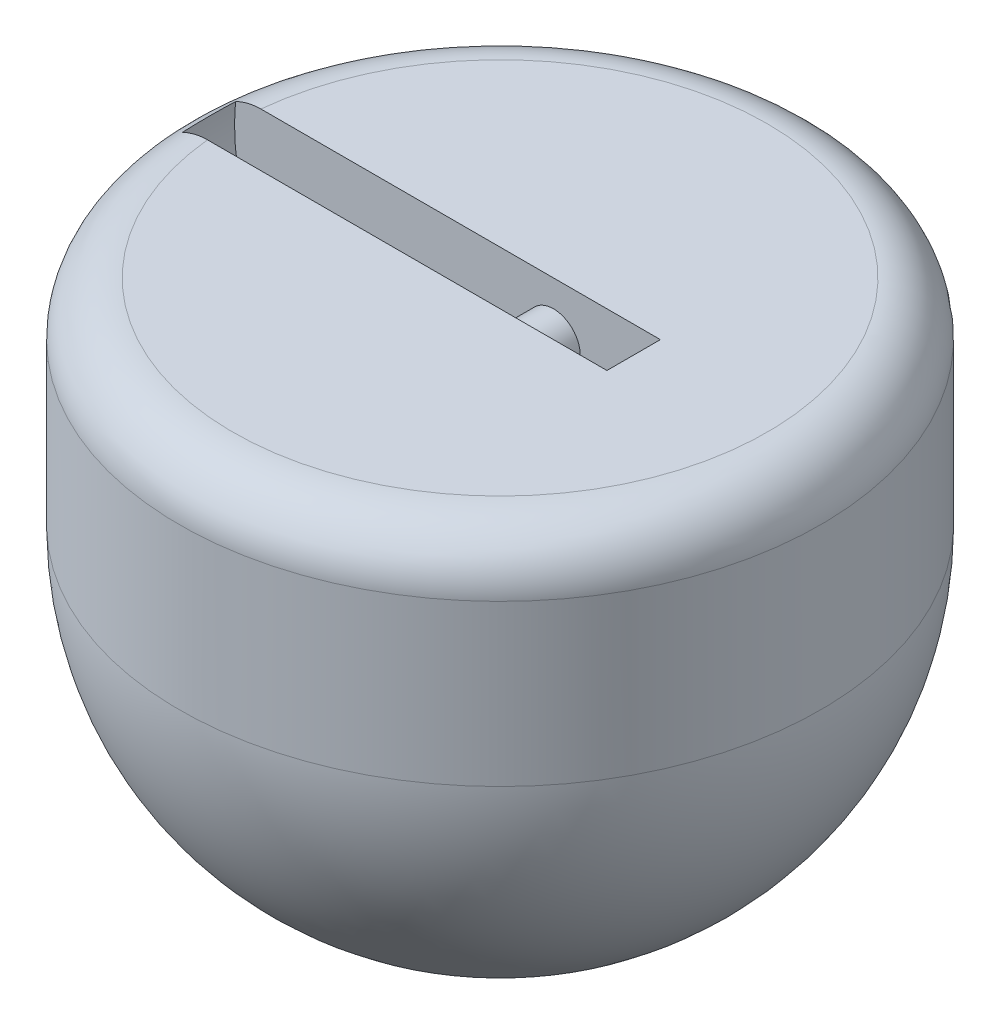
ISO-10303-21;
HEADER;
FILE_DESCRIPTION(('STEP AP214'),'2;1');
FILE_NAME('part.step','',(''),(''),'','','');
FILE_SCHEMA(('AUTOMOTIVE_DESIGN { 1 0 10303 214 1 1 1 1 }'));
ENDSEC;
DATA;
#1=APPLICATION_CONTEXT('core data for automotive mechanical design processes');
#2=APPLICATION_PROTOCOL_DEFINITION('international standard','automotive_design',2000,#1);
#3=PRODUCT_CONTEXT('',#1,'mechanical');
#4=PRODUCT('Part','Part','',(#3));
#5=PRODUCT_RELATED_PRODUCT_CATEGORY('part','',(#4));
#6=PRODUCT_DEFINITION_FORMATION('','',#4);
#7=PRODUCT_DEFINITION_CONTEXT('part definition',#1,'design');
#8=PRODUCT_DEFINITION('design','',#6,#7);
#9=PRODUCT_DEFINITION_SHAPE('','',#8);
#10=(LENGTH_UNIT() NAMED_UNIT(*) SI_UNIT(.MILLI.,.METRE.));
#11=(NAMED_UNIT(*) PLANE_ANGLE_UNIT() SI_UNIT($,.RADIAN.));
#12=(NAMED_UNIT(*) SI_UNIT($,.STERADIAN.) SOLID_ANGLE_UNIT());
#13=UNCERTAINTY_MEASURE_WITH_UNIT(LENGTH_MEASURE(1.E-05),#10,'distance_accuracy_value','');
#14=(GEOMETRIC_REPRESENTATION_CONTEXT(3) GLOBAL_UNCERTAINTY_ASSIGNED_CONTEXT((#13)) GLOBAL_UNIT_ASSIGNED_CONTEXT((#10,
#11,#12)) REPRESENTATION_CONTEXT('',''));
#15=CARTESIAN_POINT('',(0.,0.,0.));
#16=DIRECTION('',(0.,0.,1.));
#17=DIRECTION('',(1.,0.,0.));
#18=AXIS2_PLACEMENT_3D('',#15,#16,#17);
#19=CARTESIAN_POINT('',(0.,6.04095563139931,0.));
#20=DIRECTION('',(0.,1.,0.));
#21=DIRECTION('',(0.,0.,1.));
#22=AXIS2_PLACEMENT_3D('',#19,#20,#21);
#23=PLANE('',#22);
#24=DIRECTION('',(0.,0.,1.));
#25=VECTOR('',#24,1.);
#26=CARTESIAN_POINT('',(5.,6.04095563139931,-1.));
#27=LINE('',#26,#25);
#28=CARTESIAN_POINT('',(5.,6.04095563139931,-1.));
#29=VERTEX_POINT('',#28);
#30=CARTESIAN_POINT('',(5.,6.04095563139931,1.));
#31=VERTEX_POINT('',#30);
#32=EDGE_CURVE('E90',#29,#31,#27,.T.);
#33=ORIENTED_EDGE('',*,*,#32,.T.);
#34=DIRECTION('',(-1.,0.,0.));
#35=VECTOR('',#34,1.);
#36=CARTESIAN_POINT('',(5.,6.04095563139931,1.));
#37=LINE('',#36,#35);
#38=CARTESIAN_POINT('',(-9.94987437106621,6.04095563139931,1.));
#39=VERTEX_POINT('',#38);
#40=EDGE_CURVE('E88',#31,#39,#37,.T.);
#41=ORIENTED_EDGE('',*,*,#40,.T.);
#42=CARTESIAN_POINT('',(0.,6.04095563139931,0.));
#43=DIRECTION('',(0.,-1.,0.));
#44=DIRECTION('',(0.,0.,-1.));
#45=AXIS2_PLACEMENT_3D('',#42,#43,#44);
#46=CIRCLE('',#45,9.99999999999999);
#47=CARTESIAN_POINT('',(-9.94987437106621,6.04095563139931,-1.));
#48=VERTEX_POINT('',#47);
#49=EDGE_CURVE('E98',#48,#39,#46,.T.);
#50=ORIENTED_EDGE('',*,*,#49,.F.);
#51=DIRECTION('',(-1.,0.,0.));
#52=VECTOR('',#51,1.);
#53=CARTESIAN_POINT('',(5.,6.04095563139931,-1.));
#54=LINE('',#53,#52);
#55=EDGE_CURVE('E68',#29,#48,#54,.T.);
#56=ORIENTED_EDGE('',*,*,#55,.F.);
#57=EDGE_LOOP('',(#33,#41,#50,#56));
#58=FACE_BOUND('',#57,.T.);
#59=ADVANCED_FACE('F44',(#58),#23,.T.);
#60=CARTESIAN_POINT('',(0.,-1.95904436860069,0.));
#61=DIRECTION('',(0.,-1.,0.));
#62=DIRECTION('',(-1.,0.,0.));
#63=AXIS2_PLACEMENT_3D('',#60,#61,#62);
#64=SPHERICAL_SURFACE('',#63,12.);
#65=CARTESIAN_POINT('',(0.,-1.95904436860069,0.));
#66=DIRECTION('',(0.,-1.,0.));
#67=DIRECTION('',(0.,0.,-1.));
#68=AXIS2_PLACEMENT_3D('',#65,#66,#67);
#69=CIRCLE('',#68,12.);
#70=CARTESIAN_POINT('',(0.,-1.95904436860069,-12.));
#71=VERTEX_POINT('',#70);
#72=EDGE_CURVE('E94',#71,#71,#69,.T.);
#73=ORIENTED_EDGE('',*,*,#72,.T.);
#74=EDGE_LOOP('',(#73));
#75=FACE_BOUND('',#74,.T.);
#76=ADVANCED_FACE('F50',(#75),#64,.T.);
#77=CARTESIAN_POINT('',(0.,4.04095563139931,0.));
#78=DIRECTION('',(0.,-1.,0.));
#79=DIRECTION('',(0.,0.,-1.));
#80=AXIS2_PLACEMENT_3D('',#77,#78,#79);
#81=TOROIDAL_SURFACE('',#80,10.,2.);
#82=CARTESIAN_POINT('',(-9.9330885538736,6.0408858948564,-1.));
#83=CARTESIAN_POINT('',(-10.0462989429806,6.04182164584969,-1.));
#84=CARTESIAN_POINT('',(-10.159669716052,6.03322061448164,-1.));
#85=CARTESIAN_POINT('',(-10.3834570987458,5.99711763464933,-1.));
#86=CARTESIAN_POINT('',(-10.4938700575215,5.96959335361088,-1.));
#87=CARTESIAN_POINT('',(-10.7084759471421,5.89638651120352,-1.));
#88=CARTESIAN_POINT('',(-10.8126708987826,5.85070988655241,-1.));
#89=CARTESIAN_POINT('',(-11.011854670136,5.74247516742079,-1.));
#90=CARTESIAN_POINT('',(-11.1068458286359,5.67992137698877,-1.));
#91=CARTESIAN_POINT('',(-11.284677023144,5.53987159282624,-1.));
#92=CARTESIAN_POINT('',(-11.3675488453222,5.46241596676805,-1.));
#93=CARTESIAN_POINT('',(-11.519050881552,5.2946381359982,-1.));
#94=CARTESIAN_POINT('',(-11.5876808297572,5.20431569116076,-1.));
#95=CARTESIAN_POINT('',(-11.7084575531279,5.01376343128643,-1.));
#96=CARTESIAN_POINT('',(-11.7606696798913,4.91357503592281,-1.));
#97=CARTESIAN_POINT('',(-11.8474736003975,4.70583582464108,-1.));
#98=CARTESIAN_POINT('',(-11.8820657549465,4.59828515953217,-1.));
#99=CARTESIAN_POINT('',(-11.9325484689947,4.37922522543764,-1.));
#100=CARTESIAN_POINT('',(-11.9484954230977,4.2677289499922,-1.));
#101=CARTESIAN_POINT('',(-11.961416114217,4.04364303505724,-1.));
#102=CARTESIAN_POINT('',(-11.9583900791792,3.93105340871973,-1.));
#103=CARTESIAN_POINT('',(-11.9334699458617,3.70813806293273,-1.));
#104=CARTESIAN_POINT('',(-11.911601507794,3.59780947343283,-1.));
#105=CARTESIAN_POINT('',(-11.8496623483004,3.38238663334615,-1.));
#106=CARTESIAN_POINT('',(-11.8095916201206,3.27729238470154,-1.));
#107=CARTESIAN_POINT('',(-11.7123736895719,3.07525143566259,-1.));
#108=CARTESIAN_POINT('',(-11.6552168259978,2.97830938469891,-1.));
#109=CARTESIAN_POINT('',(-11.5254756035598,2.79536773687267,-1.));
#110=CARTESIAN_POINT('',(-11.4528911079313,2.70936823702567,-1.));
#111=CARTESIAN_POINT('',(-11.2941775284812,2.55052604190073,-1.));
#112=CARTESIAN_POINT('',(-11.2080165615888,2.47771520667046,-1.));
#113=CARTESIAN_POINT('',(-11.0247319627463,2.3475291665414,-1.));
#114=CARTESIAN_POINT('',(-10.9276081345681,2.29015423799733,-1.));
#115=CARTESIAN_POINT('',(-10.724771934826,2.19223805611798,-1.));
#116=CARTESIAN_POINT('',(-10.6190290600092,2.15175999405685,-1.));
#117=CARTESIAN_POINT('',(-10.4022649018946,2.08905114982704,-1.));
#118=CARTESIAN_POINT('',(-10.2912434991517,2.06682078078406,-1.));
#119=CARTESIAN_POINT('',(-10.0665938503194,2.04114952582902,-1.));
#120=CARTESIAN_POINT('',(-9.95295687784447,2.03778498756196,-1.));
#121=CARTESIAN_POINT('',(-9.72672220332156,2.05012339444204,-1.));
#122=CARTESIAN_POINT('',(-9.61412452272578,2.06582673228963,-1.));
#123=CARTESIAN_POINT('',(-9.39282884322337,2.11592327800535,-1.));
#124=CARTESIAN_POINT('',(-9.28414282139825,2.15036941311284,-1.));
#125=CARTESIAN_POINT('',(-9.07409540600064,2.23702143124835,-1.));
#126=CARTESIAN_POINT('',(-8.97273406353201,2.28922743817142,-1.));
#127=CARTESIAN_POINT('',(-8.78025102795935,2.40993340284762,-1.));
#128=CARTESIAN_POINT('',(-8.68912746847332,2.47843038358194,-1.));
#129=CARTESIAN_POINT('',(-8.51973345676084,2.62981007301945,-1.));
#130=CARTESIAN_POINT('',(-8.44146277615733,2.71269252605979,-1.));
#131=CARTESIAN_POINT('',(-8.3003722116611,2.89012979326453,-1.));
#132=CARTESIAN_POINT('',(-8.23748816928118,2.98463358120499,-1.));
#133=CARTESIAN_POINT('',(-8.12860808904975,3.18291538107857,-1.));
#134=CARTESIAN_POINT('',(-8.082611336576,3.28669300033829,-1.));
#135=CARTESIAN_POINT('',(-8.0091485392196,3.49980476468546,-1.));
#136=CARTESIAN_POINT('',(-7.98155601137057,3.60909531193778,-1.));
#137=CARTESIAN_POINT('',(-7.94522532676466,3.83076571887735,-1.));
#138=CARTESIAN_POINT('',(-7.93648648899967,3.94314546683207,-1.));
#139=CARTESIAN_POINT('',(-7.93812277660038,4.16714180915342,-1.));
#140=CARTESIAN_POINT('',(-7.94839254482273,4.27875918899683,-1.));
#141=CARTESIAN_POINT('',(-7.98752966117842,4.49868271612908,-1.));
#142=CARTESIAN_POINT('',(-8.01639692930195,4.60698887766129,-1.));
#143=CARTESIAN_POINT('',(-8.09186421351167,4.81722282419308,-1.));
#144=CARTESIAN_POINT('',(-8.1384628182143,4.91915111610824,-1.));
#145=CARTESIAN_POINT('',(-8.24802088850465,5.11379191440821,-1.));
#146=CARTESIAN_POINT('',(-8.31098013233347,5.20650454568238,-1.));
#147=CARTESIAN_POINT('',(-8.4518121205303,5.38062054686787,-1.));
#148=CARTESIAN_POINT('',(-8.52976159812118,5.46196183894586,-1.));
#149=CARTESIAN_POINT('',(-8.69814886769036,5.61053567651073,-1.));
#150=CARTESIAN_POINT('',(-8.78859019896855,5.67776420979768,-1.));
#151=CARTESIAN_POINT('',(-8.98008909028235,5.79668921783555,-1.));
#152=CARTESIAN_POINT('',(-9.08122048325843,5.8482666722358,-1.));
#153=CARTESIAN_POINT('',(-9.290601567292,5.93373996865273,-1.));
#154=CARTESIAN_POINT('',(-9.39884284054881,5.96765631043258,-1.));
#155=CARTESIAN_POINT('',(-9.57864391786225,6.00784593631209,-1.));
#156=CARTESIAN_POINT('',(-9.649005359561,6.01970115820674,-1.));
#157=CARTESIAN_POINT('',(-9.79058618819193,6.03592655261466,-1.));
#158=CARTESIAN_POINT('',(-9.86180557814151,6.04029669879523,-1.));
#159=CARTESIAN_POINT('',(-9.9330885538736,6.0408858948564,-1.));
#160=B_SPLINE_CURVE_WITH_KNOTS('',3,(#82,#83,#84,#85,#86,#87,#88,#89,#90,#91,#92,#93,#94,#95,
#96,#97,#98,#99,#100,#101,#102,#103,#104,#105,#106,#107,#108,#109,#110,#111,#112,#113,#114,#115,
#116,#117,#118,#119,#120,#121,#122,#123,#124,#125,#126,#127,#128,#129,#130,#131,#132,#133,#134,
#135,#136,#137,#138,#139,#140,#141,#142,#143,#144,#145,#146,#147,#148,#149,#150,#151,#152,#153,
#154,#155,#156,#157,#158,#159),.UNSPECIFIED.,.T.,.F.,(4,2,2,2,2,2,2,2,2,2,2,2,2,2,2,2,2,2,2,2,2,
2,2,2,2,2,2,2,2,2,2,2,2,2,2,2,2,2,4),(0.,0.339383687932989,0.679168594017307,1.01884246489528,
1.35842979320999,1.69710984428131,2.03579621676533,2.37311685350225,2.71043058260826,
3.04672140549437,3.38300818811122,3.71883772671884,4.05466738993233,4.39068730542328,
4.72671019982566,5.06353430782301,5.40036444570529,5.73844322076486,6.07652964967855,
6.41598328979461,6.75544392103303,7.09586815810949,7.43629477007588,7.77665922008624,
8.11701762165818,8.45593165539756,8.79483134560237,9.13137726826673,9.46791103446008,
9.80258511084739,10.137257747416,10.4719037501953,10.8065452172802,11.1429476062551,
11.4794455039258,11.8184416636755,12.157043458739,12.3707358086463,12.5844289103273),.UNSPECIFIED.);
#161=CARTESIAN_POINT('',(-10.9009037574161,5.80271771838134,-1.));
#162=VERTEX_POINT('',#161);
#163=EDGE_CURVE('E84',#48,#162,#160,.T.);
#164=ORIENTED_EDGE('',*,*,#163,.F.);
#165=ORIENTED_EDGE('',*,*,#49,.T.);
#166=CARTESIAN_POINT('',(-9.9330885538736,6.0408858948564,1.));
#167=CARTESIAN_POINT('',(-10.0462989429806,6.04182164584969,1.));
#168=CARTESIAN_POINT('',(-10.159669716052,6.03322061448164,1.));
#169=CARTESIAN_POINT('',(-10.3834570987458,5.99711763464933,1.));
#170=CARTESIAN_POINT('',(-10.4938700575215,5.96959335361088,1.));
#171=CARTESIAN_POINT('',(-10.7084759471421,5.89638651120352,1.));
#172=CARTESIAN_POINT('',(-10.8126708987826,5.85070988655241,1.));
#173=CARTESIAN_POINT('',(-11.011854670136,5.74247516742079,1.));
#174=CARTESIAN_POINT('',(-11.1068458286359,5.67992137698877,1.));
#175=CARTESIAN_POINT('',(-11.284677023144,5.53987159282624,1.));
#176=CARTESIAN_POINT('',(-11.3675488453222,5.46241596676805,1.));
#177=CARTESIAN_POINT('',(-11.519050881552,5.2946381359982,1.));
#178=CARTESIAN_POINT('',(-11.5876808297572,5.20431569116076,1.));
#179=CARTESIAN_POINT('',(-11.7084575531279,5.01376343128643,1.));
#180=CARTESIAN_POINT('',(-11.7606696798913,4.91357503592281,1.));
#181=CARTESIAN_POINT('',(-11.8474736003975,4.70583582464108,1.));
#182=CARTESIAN_POINT('',(-11.8820657549465,4.59828515953217,1.));
#183=CARTESIAN_POINT('',(-11.9325484689947,4.37922522543764,1.));
#184=CARTESIAN_POINT('',(-11.9484954230977,4.2677289499922,1.));
#185=CARTESIAN_POINT('',(-11.961416114217,4.04364303505724,1.));
#186=CARTESIAN_POINT('',(-11.9583900791792,3.93105340871973,1.));
#187=CARTESIAN_POINT('',(-11.9334699458617,3.70813806293273,1.));
#188=CARTESIAN_POINT('',(-11.911601507794,3.59780947343283,1.));
#189=CARTESIAN_POINT('',(-11.8496623483004,3.38238663334615,1.));
#190=CARTESIAN_POINT('',(-11.8095916201206,3.27729238470154,1.));
#191=CARTESIAN_POINT('',(-11.7123736895719,3.07525143566259,1.));
#192=CARTESIAN_POINT('',(-11.6552168259978,2.97830938469891,1.));
#193=CARTESIAN_POINT('',(-11.5254756035598,2.79536773687267,1.));
#194=CARTESIAN_POINT('',(-11.4528911079313,2.70936823702567,1.));
#195=CARTESIAN_POINT('',(-11.2941775284812,2.55052604190073,1.));
#196=CARTESIAN_POINT('',(-11.2080165615888,2.47771520667046,1.));
#197=CARTESIAN_POINT('',(-11.0247319627463,2.3475291665414,1.));
#198=CARTESIAN_POINT('',(-10.9276081345681,2.29015423799733,1.));
#199=CARTESIAN_POINT('',(-10.724771934826,2.19223805611798,1.));
#200=CARTESIAN_POINT('',(-10.6190290600092,2.15175999405685,1.));
#201=CARTESIAN_POINT('',(-10.4022649018946,2.08905114982704,1.));
#202=CARTESIAN_POINT('',(-10.2912434991517,2.06682078078406,1.));
#203=CARTESIAN_POINT('',(-10.0665938503194,2.04114952582902,1.));
#204=CARTESIAN_POINT('',(-9.95295687784447,2.03778498756196,1.));
#205=CARTESIAN_POINT('',(-9.72672220332156,2.05012339444204,1.));
#206=CARTESIAN_POINT('',(-9.61412452272578,2.06582673228963,1.));
#207=CARTESIAN_POINT('',(-9.39282884322337,2.11592327800535,1.));
#208=CARTESIAN_POINT('',(-9.28414282139825,2.15036941311284,1.));
#209=CARTESIAN_POINT('',(-9.07409540600064,2.23702143124835,1.));
#210=CARTESIAN_POINT('',(-8.97273406353201,2.28922743817142,1.));
#211=CARTESIAN_POINT('',(-8.78025102795935,2.40993340284762,1.));
#212=CARTESIAN_POINT('',(-8.68912746847332,2.47843038358194,1.));
#213=CARTESIAN_POINT('',(-8.51973345676084,2.62981007301945,1.));
#214=CARTESIAN_POINT('',(-8.44146277615733,2.71269252605979,1.));
#215=CARTESIAN_POINT('',(-8.3003722116611,2.89012979326453,1.));
#216=CARTESIAN_POINT('',(-8.23748816928118,2.98463358120499,1.));
#217=CARTESIAN_POINT('',(-8.12860808904975,3.18291538107857,1.));
#218=CARTESIAN_POINT('',(-8.082611336576,3.28669300033829,1.));
#219=CARTESIAN_POINT('',(-8.0091485392196,3.49980476468546,1.));
#220=CARTESIAN_POINT('',(-7.98155601137057,3.60909531193778,1.));
#221=CARTESIAN_POINT('',(-7.94522532676466,3.83076571887735,1.));
#222=CARTESIAN_POINT('',(-7.93648648899967,3.94314546683207,1.));
#223=CARTESIAN_POINT('',(-7.93812277660038,4.16714180915342,1.));
#224=CARTESIAN_POINT('',(-7.94839254482273,4.27875918899683,1.));
#225=CARTESIAN_POINT('',(-7.98752966117842,4.49868271612908,1.));
#226=CARTESIAN_POINT('',(-8.01639692930195,4.60698887766129,1.));
#227=CARTESIAN_POINT('',(-8.09186421351167,4.81722282419308,1.));
#228=CARTESIAN_POINT('',(-8.1384628182143,4.91915111610824,1.));
#229=CARTESIAN_POINT('',(-8.24802088850465,5.11379191440821,1.));
#230=CARTESIAN_POINT('',(-8.31098013233347,5.20650454568238,1.));
#231=CARTESIAN_POINT('',(-8.4518121205303,5.38062054686787,1.));
#232=CARTESIAN_POINT('',(-8.52976159812118,5.46196183894586,1.));
#233=CARTESIAN_POINT('',(-8.69814886769036,5.61053567651073,1.));
#234=CARTESIAN_POINT('',(-8.78859019896855,5.67776420979768,1.));
#235=CARTESIAN_POINT('',(-8.98008909028235,5.79668921783555,1.));
#236=CARTESIAN_POINT('',(-9.08122048325843,5.8482666722358,1.));
#237=CARTESIAN_POINT('',(-9.290601567292,5.93373996865273,1.));
#238=CARTESIAN_POINT('',(-9.39884284054881,5.96765631043258,1.));
#239=CARTESIAN_POINT('',(-9.57864391786225,6.00784593631209,1.));
#240=CARTESIAN_POINT('',(-9.649005359561,6.01970115820674,1.));
#241=CARTESIAN_POINT('',(-9.79058618819193,6.03592655261466,1.));
#242=CARTESIAN_POINT('',(-9.86180557814151,6.04029669879523,1.));
#243=CARTESIAN_POINT('',(-9.9330885538736,6.0408858948564,1.));
#244=B_SPLINE_CURVE_WITH_KNOTS('',3,(#166,#167,#168,#169,#170,#171,#172,#173,#174,#175,#176,
#177,#178,#179,#180,#181,#182,#183,#184,#185,#186,#187,#188,#189,#190,#191,#192,#193,#194,#195,
#196,#197,#198,#199,#200,#201,#202,#203,#204,#205,#206,#207,#208,#209,#210,#211,#212,#213,#214,
#215,#216,#217,#218,#219,#220,#221,#222,#223,#224,#225,#226,#227,#228,#229,#230,#231,#232,#233,
#234,#235,#236,#237,#238,#239,#240,#241,#242,#243),.UNSPECIFIED.,.T.,.F.,(4,2,2,2,2,2,2,2,2,2,2,
2,2,2,2,2,2,2,2,2,2,2,2,2,2,2,2,2,2,2,2,2,2,2,2,2,2,2,4),(0.,0.339383687932989,
0.679168594017307,1.01884246489528,1.35842979320999,1.69710984428131,2.03579621676533,
2.37311685350225,2.71043058260826,3.04672140549437,3.38300818811122,3.71883772671884,
4.05466738993233,4.39068730542328,4.72671019982566,5.06353430782301,5.40036444570529,
5.73844322076486,6.07652964967855,6.41598328979461,6.75544392103303,7.09586815810949,
7.43629477007588,7.77665922008624,8.11701762165818,8.45593165539756,8.79483134560237,
9.13137726826673,9.46791103446008,9.80258511084739,10.137257747416,10.4719037501953,
10.8065452172802,11.1429476062551,11.4794455039258,11.8184416636755,12.157043458739,
12.3707358086463,12.5844289103273),.UNSPECIFIED.);
#245=CARTESIAN_POINT('',(-10.9009037574055,5.80271771838031,1.));
#246=VERTEX_POINT('',#245);
#247=EDGE_CURVE('E117',#39,#246,#244,.T.);
#248=ORIENTED_EDGE('',*,*,#247,.T.);
#249=CARTESIAN_POINT('',(-10.9009047472752,5.80270737007824,-1.00019999999998));
#250=CARTESIAN_POINT('',(-10.9004924890538,5.80701449493235,-0.916897984341462));
#251=CARTESIAN_POINT('',(-10.9001343628179,5.81072466330355,-0.833566643638269));
#252=CARTESIAN_POINT('',(-10.8995233481884,5.81702049402309,-0.666862660351941));
#253=CARTESIAN_POINT('',(-10.899270457638,5.81960617941559,-0.583490018650251));
#254=CARTESIAN_POINT('',(-10.8986653396194,5.82577818075842,-0.333438906791319));
#255=CARTESIAN_POINT('',(-10.8984661404369,5.82778483275279,-0.166719453395659));
#256=CARTESIAN_POINT('',(-10.8984661404369,5.82778483275279,0.166719453395659));
#257=CARTESIAN_POINT('',(-10.8986653396194,5.82577818075842,0.333438906791318));
#258=CARTESIAN_POINT('',(-10.899270457638,5.81960617941559,0.58349001865025));
#259=CARTESIAN_POINT('',(-10.8995233481884,5.81702049402309,0.66686266035194));
#260=CARTESIAN_POINT('',(-10.9001343628179,5.81072466330355,0.833566643638268));
#261=CARTESIAN_POINT('',(-10.9004924890538,5.80701449493235,0.916897984341462));
#262=CARTESIAN_POINT('',(-10.9009047472752,5.80270737007824,1.00019999999998));
#263=B_SPLINE_CURVE_WITH_KNOTS('',3,(#249,#250,#251,#252,#253,#254,#255,#256,#257,#258,#259,
#260,#261,#262),.UNSPECIFIED.,.F.,.F.,(4,2,2,2,2,2,4),(0.,0.250237729780698,0.500470331168158,
1.00061183689406,1.50075334261997,1.75098594400743,2.00122367378813),.UNSPECIFIED.);
#264=EDGE_CURVE('E127',#162,#246,#263,.T.);
#265=ORIENTED_EDGE('',*,*,#264,.F.);
#266=EDGE_LOOP('',(#164,#165,#248,#265));
#267=FACE_BOUND('',#266,.T.);
#268=CARTESIAN_POINT('',(0.,4.0409556313993,0.));
#269=DIRECTION('',(0.,-1.,0.));
#270=DIRECTION('',(0.,0.,-1.));
#271=AXIS2_PLACEMENT_3D('',#268,#269,#270);
#272=CIRCLE('',#271,12.);
#273=CARTESIAN_POINT('',(0.,4.0409556313993,-12.));
#274=VERTEX_POINT('',#273);
#275=EDGE_CURVE('E112',#274,#274,#272,.T.);
#276=ORIENTED_EDGE('',*,*,#275,.F.);
#277=EDGE_LOOP('',(#276));
#278=FACE_BOUND('',#277,.T.);
#279=ADVANCED_FACE('F134',(#267,#278),#81,.T.);
#280=CARTESIAN_POINT('',(0.,-13.9590443686007,0.));
#281=DIRECTION('',(0.,-1.,0.));
#282=DIRECTION('',(0.,0.,-1.));
#283=AXIS2_PLACEMENT_3D('',#280,#281,#282);
#284=CYLINDRICAL_SURFACE('',#283,12.);
#285=ORIENTED_EDGE('',*,*,#275,.T.);
#286=EDGE_LOOP('',(#285));
#287=FACE_BOUND('',#286,.T.);
#288=ORIENTED_EDGE('',*,*,#72,.F.);
#289=EDGE_LOOP('',(#288));
#290=FACE_BOUND('',#289,.T.);
#291=ADVANCED_FACE('F148',(#287,#290),#284,.T.);
#292=CARTESIAN_POINT('',(-2.93725393319377,5.04095563139931,-1.));
#293=DIRECTION('',(0.,0.,1.));
#294=DIRECTION('',(1.,0.,0.));
#295=AXIS2_PLACEMENT_3D('',#292,#293,#294);
#296=CYLINDRICAL_SURFACE('',#295,8.);
#297=CARTESIAN_POINT('',(-2.93725393319377,5.04095563139931,-1.));
#298=DIRECTION('',(0.,0.,1.));
#299=DIRECTION('',(-1.,0.,0.));
#300=AXIS2_PLACEMENT_3D('',#297,#298,#299);
#301=CIRCLE('',#300,8.);
#302=EDGE_CURVE('E80',#162,#29,#301,.T.);
#303=ORIENTED_EDGE('',*,*,#302,.F.);
#304=ORIENTED_EDGE('',*,*,#264,.T.);
#305=CARTESIAN_POINT('',(-2.93725393319377,5.04095563139931,1.));
#306=DIRECTION('',(0.,0.,1.));
#307=DIRECTION('',(-1.,0.,0.));
#308=AXIS2_PLACEMENT_3D('',#305,#306,#307);
#309=CIRCLE('',#308,8.);
#310=EDGE_CURVE('E61',#246,#31,#309,.T.);
#311=ORIENTED_EDGE('',*,*,#310,.T.);
#312=ORIENTED_EDGE('',*,*,#32,.F.);
#313=EDGE_LOOP('',(#303,#304,#311,#312));
#314=FACE_BOUND('',#313,.T.);
#315=ADVANCED_FACE('F89',(#314),#296,.F.);
#316=CARTESIAN_POINT('',(-2.93725393319377,5.04095563139931,-1.));
#317=DIRECTION('',(0.,0.,-1.));
#318=DIRECTION('',(-1.,0.,0.));
#319=AXIS2_PLACEMENT_3D('',#316,#317,#318);
#320=PLANE('',#319);
#321=CARTESIAN_POINT('',(-3.,1.04095563139931,-1.));
#322=DIRECTION('',(0.,0.,-1.));
#323=DIRECTION('',(-1.,0.,0.));
#324=AXIS2_PLACEMENT_3D('',#321,#322,#323);
#325=CIRCLE('',#324,1.);
#326=CARTESIAN_POINT('',(-4.,1.04095563139931,-1.));
#327=VERTEX_POINT('',#326);
#328=EDGE_CURVE('E11',#327,#327,#325,.F.);
#329=ORIENTED_EDGE('',*,*,#328,.F.);
#330=EDGE_LOOP('',(#329));
#331=FACE_BOUND('',#330,.T.);
#332=CARTESIAN_POINT('',(1.,4.04095563139931,-1.));
#333=DIRECTION('',(0.,0.,-1.));
#334=DIRECTION('',(-1.,0.,0.));
#335=AXIS2_PLACEMENT_3D('',#332,#333,#334);
#336=CIRCLE('',#335,1.);
#337=CARTESIAN_POINT('',(0.,4.04095563139931,-1.));
#338=VERTEX_POINT('',#337);
#339=EDGE_CURVE('E53',#338,#338,#336,.F.);
#340=ORIENTED_EDGE('',*,*,#339,.F.);
#341=EDGE_LOOP('',(#340));
#342=FACE_BOUND('',#341,.T.);
#343=ORIENTED_EDGE('',*,*,#163,.T.);
#344=ORIENTED_EDGE('',*,*,#302,.T.);
#345=ORIENTED_EDGE('',*,*,#55,.T.);
#346=EDGE_LOOP('',(#343,#344,#345));
#347=FACE_BOUND('',#346,.T.);
#348=ADVANCED_FACE('F82',(#331,#342,#347),#320,.F.);
#349=CARTESIAN_POINT('',(-2.93725393319377,5.04095563139931,1.));
#350=DIRECTION('',(0.,0.,-1.));
#351=DIRECTION('',(-1.,0.,0.));
#352=AXIS2_PLACEMENT_3D('',#349,#350,#351);
#353=PLANE('',#352);
#354=CARTESIAN_POINT('',(-3.,1.04095563139931,1.));
#355=DIRECTION('',(0.,0.,1.));
#356=DIRECTION('',(1.,0.,0.));
#357=AXIS2_PLACEMENT_3D('',#354,#355,#356);
#358=CIRCLE('',#357,1.);
#359=CARTESIAN_POINT('',(-2.,1.04095563139931,1.));
#360=VERTEX_POINT('',#359);
#361=EDGE_CURVE('E104',#360,#360,#358,.T.);
#362=ORIENTED_EDGE('',*,*,#361,.T.);
#363=EDGE_LOOP('',(#362));
#364=FACE_BOUND('',#363,.T.);
#365=CARTESIAN_POINT('',(1.,4.04095563139931,1.));
#366=DIRECTION('',(0.,0.,1.));
#367=DIRECTION('',(1.,0.,0.));
#368=AXIS2_PLACEMENT_3D('',#365,#366,#367);
#369=CIRCLE('',#368,1.);
#370=CARTESIAN_POINT('',(2.,4.04095563139931,1.));
#371=VERTEX_POINT('',#370);
#372=EDGE_CURVE('E235',#371,#371,#369,.T.);
#373=ORIENTED_EDGE('',*,*,#372,.T.);
#374=EDGE_LOOP('',(#373));
#375=FACE_BOUND('',#374,.T.);
#376=ORIENTED_EDGE('',*,*,#40,.F.);
#377=ORIENTED_EDGE('',*,*,#310,.F.);
#378=ORIENTED_EDGE('',*,*,#247,.F.);
#379=EDGE_LOOP('',(#376,#377,#378));
#380=FACE_BOUND('',#379,.T.);
#381=ADVANCED_FACE('F136',(#364,#375,#380),#353,.T.);
#382=CARTESIAN_POINT('',(1.,4.04095563139931,1.));
#383=DIRECTION('',(0.,0.,-1.));
#384=DIRECTION('',(-1.,0.,0.));
#385=AXIS2_PLACEMENT_3D('',#382,#383,#384);
#386=CYLINDRICAL_SURFACE('',#385,1.);
#387=ORIENTED_EDGE('',*,*,#372,.F.);
#388=EDGE_LOOP('',(#387));
#389=FACE_BOUND('',#388,.T.);
#390=ORIENTED_EDGE('',*,*,#339,.T.);
#391=EDGE_LOOP('',(#390));
#392=FACE_BOUND('',#391,.T.);
#393=ADVANCED_FACE('F140',(#389,#392),#386,.T.);
#394=CARTESIAN_POINT('',(-3.,1.04095563139931,1.));
#395=DIRECTION('',(0.,0.,-1.));
#396=DIRECTION('',(-1.,0.,0.));
#397=AXIS2_PLACEMENT_3D('',#394,#395,#396);
#398=CYLINDRICAL_SURFACE('',#397,1.);
#399=ORIENTED_EDGE('',*,*,#361,.F.);
#400=EDGE_LOOP('',(#399));
#401=FACE_BOUND('',#400,.T.);
#402=ORIENTED_EDGE('',*,*,#328,.T.);
#403=EDGE_LOOP('',(#402));
#404=FACE_BOUND('',#403,.T.);
#405=ADVANCED_FACE('F206',(#401,#404),#398,.T.);
#406=CLOSED_SHELL('',(#59,#76,#279,#291,#315,#348,#381,#393,#405));
#407=MANIFOLD_SOLID_BREP('B2',#406);
#408=ADVANCED_BREP_SHAPE_REPRESENTATION('',(#18,#407),#14);
#409=SHAPE_DEFINITION_REPRESENTATION(#9,#408);
ENDSEC;
END-ISO-10303-21;
